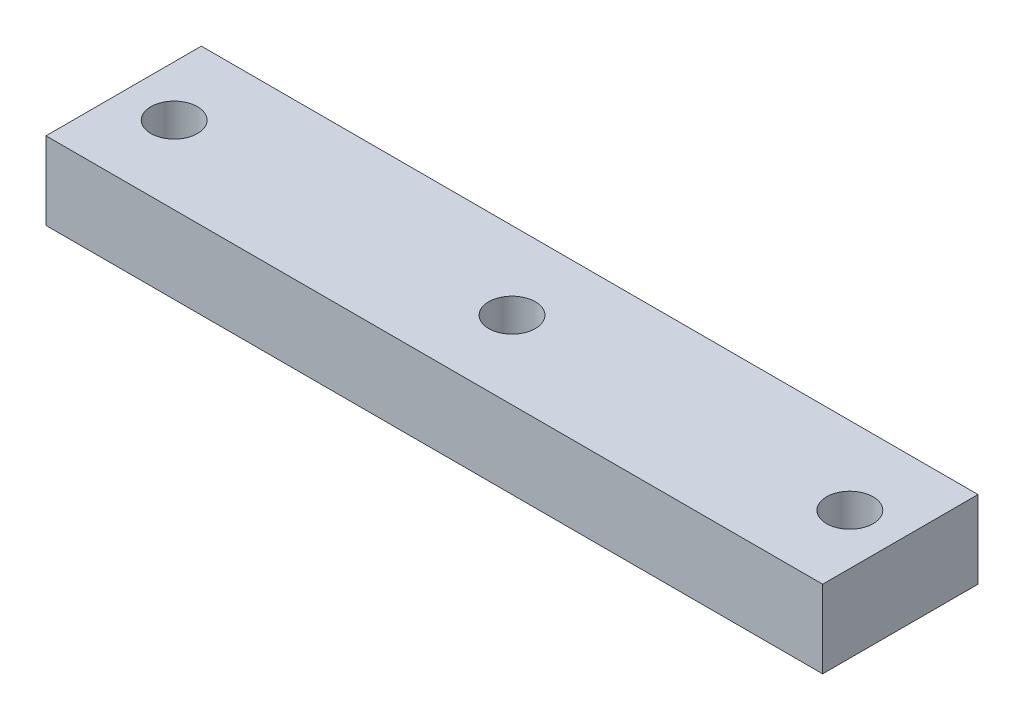
ISO-10303-21;
HEADER;
FILE_DESCRIPTION(('STEP AP214'),'2;1');
FILE_NAME('part.step','',(''),(''),'','','');
FILE_SCHEMA(('AUTOMOTIVE_DESIGN { 1 0 10303 214 1 1 1 1 }'));
ENDSEC;
DATA;
#1=APPLICATION_CONTEXT('core data for automotive mechanical design processes');
#2=APPLICATION_PROTOCOL_DEFINITION('international standard','automotive_design',2000,#1);
#3=PRODUCT_CONTEXT('',#1,'mechanical');
#4=PRODUCT('Part','Part','',(#3));
#5=PRODUCT_RELATED_PRODUCT_CATEGORY('part','',(#4));
#6=PRODUCT_DEFINITION_FORMATION('','',#4);
#7=PRODUCT_DEFINITION_CONTEXT('part definition',#1,'design');
#8=PRODUCT_DEFINITION('design','',#6,#7);
#9=PRODUCT_DEFINITION_SHAPE('','',#8);
#10=(LENGTH_UNIT() NAMED_UNIT(*) SI_UNIT(.MILLI.,.METRE.));
#11=(NAMED_UNIT(*) PLANE_ANGLE_UNIT() SI_UNIT($,.RADIAN.));
#12=(NAMED_UNIT(*) SI_UNIT($,.STERADIAN.) SOLID_ANGLE_UNIT());
#13=UNCERTAINTY_MEASURE_WITH_UNIT(LENGTH_MEASURE(1.E-05),#10,'distance_accuracy_value','');
#14=(GEOMETRIC_REPRESENTATION_CONTEXT(3) GLOBAL_UNCERTAINTY_ASSIGNED_CONTEXT((#13)) GLOBAL_UNIT_ASSIGNED_CONTEXT((#10,
#11,#12)) REPRESENTATION_CONTEXT('',''));
#15=CARTESIAN_POINT('',(0.,0.,0.));
#16=DIRECTION('',(0.,0.,1.));
#17=DIRECTION('',(1.,0.,0.));
#18=AXIS2_PLACEMENT_3D('',#15,#16,#17);
#19=CARTESIAN_POINT('',(0.,5.,0.));
#20=DIRECTION('',(0.,-1.,0.));
#21=DIRECTION('',(0.,0.,-1.));
#22=AXIS2_PLACEMENT_3D('',#19,#20,#21);
#23=PLANE('',#22);
#24=DIRECTION('',(0.,0.,-1.));
#25=VECTOR('',#24,1.);
#26=CARTESIAN_POINT('',(-1.23459788359459,5.,0.));
#27=LINE('',#26,#25);
#28=CARTESIAN_POINT('',(-1.23459788359459,5.,10.));
#29=VERTEX_POINT('',#28);
#30=CARTESIAN_POINT('',(-1.23459788359459,5.,0.));
#31=VERTEX_POINT('',#30);
#32=EDGE_CURVE('E85',#29,#31,#27,.T.);
#33=ORIENTED_EDGE('',*,*,#32,.T.);
#34=DIRECTION('',(-1.,0.,0.));
#35=VECTOR('',#34,1.);
#36=CARTESIAN_POINT('',(-1.23459788359459,5.,0.));
#37=LINE('',#36,#35);
#38=CARTESIAN_POINT('',(-51.2345978835946,5.,0.));
#39=VERTEX_POINT('',#38);
#40=EDGE_CURVE('E80',#31,#39,#37,.T.);
#41=ORIENTED_EDGE('',*,*,#40,.T.);
#42=DIRECTION('',(0.,0.,1.));
#43=VECTOR('',#42,1.);
#44=CARTESIAN_POINT('',(-51.2345978835946,5.,0.));
#45=LINE('',#44,#43);
#46=CARTESIAN_POINT('',(-51.2345978835946,5.,10.));
#47=VERTEX_POINT('',#46);
#48=EDGE_CURVE('E83',#39,#47,#45,.T.);
#49=ORIENTED_EDGE('',*,*,#48,.T.);
#50=DIRECTION('',(1.,0.,0.));
#51=VECTOR('',#50,1.);
#52=CARTESIAN_POINT('',(-1.23459788359459,5.,10.));
#53=LINE('',#52,#51);
#54=EDGE_CURVE('E50',#47,#29,#53,.T.);
#55=ORIENTED_EDGE('',*,*,#54,.T.);
#56=EDGE_LOOP('',(#33,#41,#49,#55));
#57=FACE_BOUND('',#56,.T.);
#58=CARTESIAN_POINT('',(-4.48459788359459,5.,5.));
#59=DIRECTION('',(0.,1.,0.));
#60=DIRECTION('',(0.,0.,1.));
#61=AXIS2_PLACEMENT_3D('',#58,#59,#60);
#62=CIRCLE('',#61,1.5);
#63=CARTESIAN_POINT('',(-4.48459788359459,5.,6.5));
#64=VERTEX_POINT('',#63);
#65=EDGE_CURVE('E100',#64,#64,#62,.T.);
#66=ORIENTED_EDGE('',*,*,#65,.F.);
#67=EDGE_LOOP('',(#66));
#68=FACE_BOUND('',#67,.T.);
#69=CARTESIAN_POINT('',(-26.2345978835946,5.,5.00000000000015));
#70=DIRECTION('',(0.,1.,0.));
#71=DIRECTION('',(0.,0.,1.));
#72=AXIS2_PLACEMENT_3D('',#69,#70,#71);
#73=CIRCLE('',#72,1.5);
#74=CARTESIAN_POINT('',(-26.2345978835946,5.,6.50000000000015));
#75=VERTEX_POINT('',#74);
#76=EDGE_CURVE('E115',#75,#75,#73,.T.);
#77=ORIENTED_EDGE('',*,*,#76,.F.);
#78=EDGE_LOOP('',(#77));
#79=FACE_BOUND('',#78,.T.);
#80=CARTESIAN_POINT('',(-47.9845978835946,5.,5.0000000000003));
#81=DIRECTION('',(0.,1.,0.));
#82=DIRECTION('',(0.,0.,1.));
#83=AXIS2_PLACEMENT_3D('',#80,#81,#82);
#84=CIRCLE('',#83,1.5);
#85=CARTESIAN_POINT('',(-47.9845978835946,5.,6.5000000000003));
#86=VERTEX_POINT('',#85);
#87=EDGE_CURVE('E121',#86,#86,#84,.T.);
#88=ORIENTED_EDGE('',*,*,#87,.F.);
#89=EDGE_LOOP('',(#88));
#90=FACE_BOUND('',#89,.T.);
#91=ADVANCED_FACE('F33',(#57,#68,#79,#90),#23,.F.);
#92=CARTESIAN_POINT('',(0.,0.,0.));
#93=DIRECTION('',(0.,-1.,0.));
#94=DIRECTION('',(0.,0.,-1.));
#95=AXIS2_PLACEMENT_3D('',#92,#93,#94);
#96=PLANE('',#95);
#97=CARTESIAN_POINT('',(-26.2345978835946,0.,5.00000000000015));
#98=DIRECTION('',(0.,1.,0.));
#99=DIRECTION('',(0.,0.,1.));
#100=AXIS2_PLACEMENT_3D('',#97,#98,#99);
#101=CIRCLE('',#100,1.5);
#102=CARTESIAN_POINT('',(-26.2345978835946,0.,6.50000000000015));
#103=VERTEX_POINT('',#102);
#104=EDGE_CURVE('E118',#103,#103,#101,.T.);
#105=ORIENTED_EDGE('',*,*,#104,.T.);
#106=EDGE_LOOP('',(#105));
#107=FACE_BOUND('',#106,.T.);
#108=DIRECTION('',(0.,0.,-1.));
#109=VECTOR('',#108,1.);
#110=CARTESIAN_POINT('',(-1.23459788359459,0.,0.));
#111=LINE('',#110,#109);
#112=CARTESIAN_POINT('',(-1.23459788359459,0.,10.));
#113=VERTEX_POINT('',#112);
#114=CARTESIAN_POINT('',(-1.23459788359459,0.,0.));
#115=VERTEX_POINT('',#114);
#116=EDGE_CURVE('E97',#113,#115,#111,.T.);
#117=ORIENTED_EDGE('',*,*,#116,.F.);
#118=DIRECTION('',(1.,0.,0.));
#119=VECTOR('',#118,1.);
#120=CARTESIAN_POINT('',(-1.23459788359459,0.,10.));
#121=LINE('',#120,#119);
#122=CARTESIAN_POINT('',(-51.2345978835946,0.,10.));
#123=VERTEX_POINT('',#122);
#124=EDGE_CURVE('E73',#123,#113,#121,.T.);
#125=ORIENTED_EDGE('',*,*,#124,.F.);
#126=DIRECTION('',(0.,0.,1.));
#127=VECTOR('',#126,1.);
#128=CARTESIAN_POINT('',(-51.2345978835946,0.,0.));
#129=LINE('',#128,#127);
#130=CARTESIAN_POINT('',(-51.2345978835946,0.,0.));
#131=VERTEX_POINT('',#130);
#132=EDGE_CURVE('E67',#131,#123,#129,.T.);
#133=ORIENTED_EDGE('',*,*,#132,.F.);
#134=DIRECTION('',(-1.,0.,0.));
#135=VECTOR('',#134,1.);
#136=CARTESIAN_POINT('',(-1.23459788359459,0.,0.));
#137=LINE('',#136,#135);
#138=EDGE_CURVE('E89',#115,#131,#137,.T.);
#139=ORIENTED_EDGE('',*,*,#138,.F.);
#140=EDGE_LOOP('',(#117,#125,#133,#139));
#141=FACE_BOUND('',#140,.T.);
#142=CARTESIAN_POINT('',(-4.48459788359459,0.,5.));
#143=DIRECTION('',(0.,1.,0.));
#144=DIRECTION('',(0.,0.,1.));
#145=AXIS2_PLACEMENT_3D('',#142,#143,#144);
#146=CIRCLE('',#145,1.5);
#147=CARTESIAN_POINT('',(-4.48459788359459,0.,6.5));
#148=VERTEX_POINT('',#147);
#149=EDGE_CURVE('E112',#148,#148,#146,.T.);
#150=ORIENTED_EDGE('',*,*,#149,.T.);
#151=EDGE_LOOP('',(#150));
#152=FACE_BOUND('',#151,.T.);
#153=CARTESIAN_POINT('',(-47.9845978835946,0.,5.0000000000003));
#154=DIRECTION('',(0.,1.,0.));
#155=DIRECTION('',(0.,0.,1.));
#156=AXIS2_PLACEMENT_3D('',#153,#154,#155);
#157=CIRCLE('',#156,1.5);
#158=CARTESIAN_POINT('',(-47.9845978835946,0.,6.5000000000003));
#159=VERTEX_POINT('',#158);
#160=EDGE_CURVE('E124',#159,#159,#157,.T.);
#161=ORIENTED_EDGE('',*,*,#160,.T.);
#162=EDGE_LOOP('',(#161));
#163=FACE_BOUND('',#162,.T.);
#164=ADVANCED_FACE('F108',(#107,#141,#152,#163),#96,.T.);
#165=CARTESIAN_POINT('',(-1.23459788359459,5.,0.));
#166=DIRECTION('',(-1.,0.,0.));
#167=DIRECTION('',(0.,0.,1.));
#168=AXIS2_PLACEMENT_3D('',#165,#166,#167);
#169=PLANE('',#168);
#170=ORIENTED_EDGE('',*,*,#116,.T.);
#171=DIRECTION('',(0.,-1.,0.));
#172=VECTOR('',#171,1.);
#173=CARTESIAN_POINT('',(-1.23459788359459,5.,0.));
#174=LINE('',#173,#172);
#175=EDGE_CURVE('E11',#31,#115,#174,.T.);
#176=ORIENTED_EDGE('',*,*,#175,.F.);
#177=ORIENTED_EDGE('',*,*,#32,.F.);
#178=DIRECTION('',(0.,-1.,0.));
#179=VECTOR('',#178,1.);
#180=CARTESIAN_POINT('',(-1.23459788359459,5.,10.));
#181=LINE('',#180,#179);
#182=EDGE_CURVE('E93',#29,#113,#181,.T.);
#183=ORIENTED_EDGE('',*,*,#182,.T.);
#184=EDGE_LOOP('',(#170,#176,#177,#183));
#185=FACE_BOUND('',#184,.T.);
#186=ADVANCED_FACE('F35',(#185),#169,.F.);
#187=CARTESIAN_POINT('',(-1.23459788359459,5.,0.));
#188=DIRECTION('',(0.,0.,1.));
#189=DIRECTION('',(1.,0.,0.));
#190=AXIS2_PLACEMENT_3D('',#187,#188,#189);
#191=PLANE('',#190);
#192=ORIENTED_EDGE('',*,*,#138,.T.);
#193=DIRECTION('',(0.,-1.,0.));
#194=VECTOR('',#193,1.);
#195=CARTESIAN_POINT('',(-51.2345978835946,5.,0.));
#196=LINE('',#195,#194);
#197=EDGE_CURVE('E42',#39,#131,#196,.T.);
#198=ORIENTED_EDGE('',*,*,#197,.F.);
#199=ORIENTED_EDGE('',*,*,#40,.F.);
#200=ORIENTED_EDGE('',*,*,#175,.T.);
#201=EDGE_LOOP('',(#192,#198,#199,#200));
#202=FACE_BOUND('',#201,.T.);
#203=ADVANCED_FACE('F88',(#202),#191,.F.);
#204=CARTESIAN_POINT('',(-51.2345978835946,5.,0.));
#205=DIRECTION('',(1.,0.,0.));
#206=DIRECTION('',(0.,0.,-1.));
#207=AXIS2_PLACEMENT_3D('',#204,#205,#206);
#208=PLANE('',#207);
#209=ORIENTED_EDGE('',*,*,#132,.T.);
#210=DIRECTION('',(0.,-1.,0.));
#211=VECTOR('',#210,1.);
#212=CARTESIAN_POINT('',(-51.2345978835946,5.,10.));
#213=LINE('',#212,#211);
#214=EDGE_CURVE('E90',#47,#123,#213,.T.);
#215=ORIENTED_EDGE('',*,*,#214,.F.);
#216=ORIENTED_EDGE('',*,*,#48,.F.);
#217=ORIENTED_EDGE('',*,*,#197,.T.);
#218=EDGE_LOOP('',(#209,#215,#216,#217));
#219=FACE_BOUND('',#218,.T.);
#220=ADVANCED_FACE('F91',(#219),#208,.F.);
#221=CARTESIAN_POINT('',(-1.23459788359459,5.,10.));
#222=DIRECTION('',(0.,0.,-1.));
#223=DIRECTION('',(-1.,0.,0.));
#224=AXIS2_PLACEMENT_3D('',#221,#222,#223);
#225=PLANE('',#224);
#226=ORIENTED_EDGE('',*,*,#124,.T.);
#227=ORIENTED_EDGE('',*,*,#182,.F.);
#228=ORIENTED_EDGE('',*,*,#54,.F.);
#229=ORIENTED_EDGE('',*,*,#214,.T.);
#230=EDGE_LOOP('',(#226,#227,#228,#229));
#231=FACE_BOUND('',#230,.T.);
#232=ADVANCED_FACE('F105',(#231),#225,.F.);
#233=CARTESIAN_POINT('',(-4.48459788359459,5.,5.));
#234=DIRECTION('',(0.,-1.,0.));
#235=DIRECTION('',(0.,0.,-1.));
#236=AXIS2_PLACEMENT_3D('',#233,#234,#235);
#237=CYLINDRICAL_SURFACE('',#236,1.5);
#238=ORIENTED_EDGE('',*,*,#65,.T.);
#239=EDGE_LOOP('',(#238));
#240=FACE_BOUND('',#239,.T.);
#241=ORIENTED_EDGE('',*,*,#149,.F.);
#242=EDGE_LOOP('',(#241));
#243=FACE_BOUND('',#242,.T.);
#244=ADVANCED_FACE('F141',(#240,#243),#237,.F.);
#245=CARTESIAN_POINT('',(-26.2345978835946,5.,5.00000000000015));
#246=DIRECTION('',(0.,-1.,0.));
#247=DIRECTION('',(0.,0.,-1.));
#248=AXIS2_PLACEMENT_3D('',#245,#246,#247);
#249=CYLINDRICAL_SURFACE('',#248,1.5);
#250=ORIENTED_EDGE('',*,*,#76,.T.);
#251=EDGE_LOOP('',(#250));
#252=FACE_BOUND('',#251,.T.);
#253=ORIENTED_EDGE('',*,*,#104,.F.);
#254=EDGE_LOOP('',(#253));
#255=FACE_BOUND('',#254,.T.);
#256=ADVANCED_FACE('F187',(#252,#255),#249,.F.);
#257=CARTESIAN_POINT('',(-47.9845978835946,5.,5.0000000000003));
#258=DIRECTION('',(0.,-1.,0.));
#259=DIRECTION('',(0.,0.,-1.));
#260=AXIS2_PLACEMENT_3D('',#257,#258,#259);
#261=CYLINDRICAL_SURFACE('',#260,1.5);
#262=ORIENTED_EDGE('',*,*,#87,.T.);
#263=EDGE_LOOP('',(#262));
#264=FACE_BOUND('',#263,.T.);
#265=ORIENTED_EDGE('',*,*,#160,.F.);
#266=EDGE_LOOP('',(#265));
#267=FACE_BOUND('',#266,.T.);
#268=ADVANCED_FACE('F130',(#264,#267),#261,.F.);
#269=CLOSED_SHELL('',(#91,#164,#186,#203,#220,#232,#244,#256,#268));
#270=MANIFOLD_SOLID_BREP('B2',#269);
#271=ADVANCED_BREP_SHAPE_REPRESENTATION('',(#18,#270),#14);
#272=SHAPE_DEFINITION_REPRESENTATION(#9,#271);
ENDSEC;
END-ISO-10303-21;
